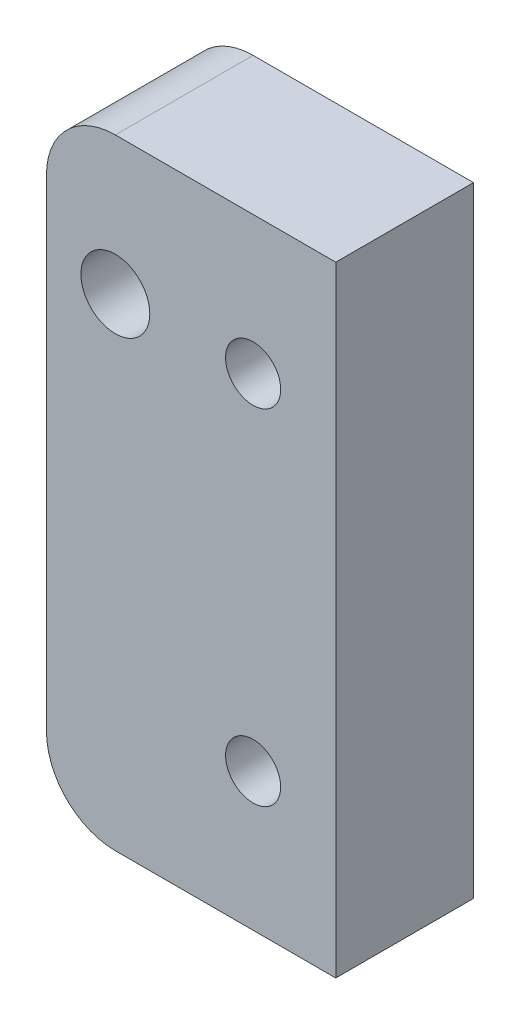
ISO-10303-21;
HEADER;
FILE_DESCRIPTION(('STEP AP214'),'2;1');
FILE_NAME('part.step','',(''),(''),'','','');
FILE_SCHEMA(('AUTOMOTIVE_DESIGN { 1 0 10303 214 1 1 1 1 }'));
ENDSEC;
DATA;
#1=APPLICATION_CONTEXT('core data for automotive mechanical design processes');
#2=APPLICATION_PROTOCOL_DEFINITION('international standard','automotive_design',2000,#1);
#3=PRODUCT_CONTEXT('',#1,'mechanical');
#4=PRODUCT('Part','Part','',(#3));
#5=PRODUCT_RELATED_PRODUCT_CATEGORY('part','',(#4));
#6=PRODUCT_DEFINITION_FORMATION('','',#4);
#7=PRODUCT_DEFINITION_CONTEXT('part definition',#1,'design');
#8=PRODUCT_DEFINITION('design','',#6,#7);
#9=PRODUCT_DEFINITION_SHAPE('','',#8);
#10=(LENGTH_UNIT() NAMED_UNIT(*) SI_UNIT(.MILLI.,.METRE.));
#11=(NAMED_UNIT(*) PLANE_ANGLE_UNIT() SI_UNIT($,.RADIAN.));
#12=(NAMED_UNIT(*) SI_UNIT($,.STERADIAN.) SOLID_ANGLE_UNIT());
#13=UNCERTAINTY_MEASURE_WITH_UNIT(LENGTH_MEASURE(1.E-05),#10,'distance_accuracy_value','');
#14=(GEOMETRIC_REPRESENTATION_CONTEXT(3) GLOBAL_UNCERTAINTY_ASSIGNED_CONTEXT((#13)) GLOBAL_UNIT_ASSIGNED_CONTEXT((#10,
#11,#12)) REPRESENTATION_CONTEXT('',''));
#15=CARTESIAN_POINT('',(0.,0.,0.));
#16=DIRECTION('',(0.,0.,1.));
#17=DIRECTION('',(1.,0.,0.));
#18=AXIS2_PLACEMENT_3D('',#15,#16,#17);
#19=CARTESIAN_POINT('',(-13.1067945180219,-17.1503131524008,0.));
#20=DIRECTION('',(0.,0.,1.));
#21=DIRECTION('',(1.,0.,0.));
#22=AXIS2_PLACEMENT_3D('',#19,#20,#21);
#23=CYLINDRICAL_SURFACE('',#22,2.);
#24=CARTESIAN_POINT('',(-13.1067945180219,-17.1503131524008,10.));
#25=DIRECTION('',(0.,0.,1.));
#26=DIRECTION('',(1.,0.,0.));
#27=AXIS2_PLACEMENT_3D('',#24,#25,#26);
#28=CIRCLE('',#27,2.);
#29=CARTESIAN_POINT('',(-11.1067945180219,-17.1503131524008,10.));
#30=VERTEX_POINT('',#29);
#31=EDGE_CURVE('E264',#30,#30,#28,.T.);
#32=ORIENTED_EDGE('',*,*,#31,.T.);
#33=EDGE_LOOP('',(#32));
#34=FACE_BOUND('',#33,.T.);
#35=CARTESIAN_POINT('',(-13.1067945180219,-17.1503131524008,4.));
#36=DIRECTION('',(0.,0.,-1.));
#37=DIRECTION('',(-1.,0.,0.));
#38=AXIS2_PLACEMENT_3D('',#35,#36,#37);
#39=CIRCLE('',#38,2.);
#40=CARTESIAN_POINT('',(-15.1067945180219,-17.1503131524008,4.));
#41=VERTEX_POINT('',#40);
#42=EDGE_CURVE('E39',#41,#41,#39,.F.);
#43=ORIENTED_EDGE('',*,*,#42,.F.);
#44=EDGE_LOOP('',(#43));
#45=FACE_BOUND('',#44,.T.);
#46=ADVANCED_FACE('F35',(#34,#45),#23,.F.);
#47=CARTESIAN_POINT('',(-13.1067945180219,7.84968684759917,0.));
#48=DIRECTION('',(0.,0.,1.));
#49=DIRECTION('',(1.,0.,0.));
#50=AXIS2_PLACEMENT_3D('',#47,#48,#49);
#51=CYLINDRICAL_SURFACE('',#50,2.);
#52=CARTESIAN_POINT('',(-13.1067945180219,7.84968684759917,10.));
#53=DIRECTION('',(0.,0.,1.));
#54=DIRECTION('',(1.,0.,0.));
#55=AXIS2_PLACEMENT_3D('',#52,#53,#54);
#56=CIRCLE('',#55,2.);
#57=CARTESIAN_POINT('',(-11.1067945180219,7.84968684759917,10.));
#58=VERTEX_POINT('',#57);
#59=EDGE_CURVE('E267',#58,#58,#56,.T.);
#60=ORIENTED_EDGE('',*,*,#59,.T.);
#61=EDGE_LOOP('',(#60));
#62=FACE_BOUND('',#61,.T.);
#63=CARTESIAN_POINT('',(-13.1067945180219,7.84968684759917,4.));
#64=DIRECTION('',(0.,0.,-1.));
#65=DIRECTION('',(-1.,0.,0.));
#66=AXIS2_PLACEMENT_3D('',#63,#64,#65);
#67=CIRCLE('',#66,2.);
#68=CARTESIAN_POINT('',(-15.1067945180219,7.84968684759917,4.));
#69=VERTEX_POINT('',#68);
#70=EDGE_CURVE('E254',#69,#69,#67,.F.);
#71=ORIENTED_EDGE('',*,*,#70,.F.);
#72=EDGE_LOOP('',(#71));
#73=FACE_BOUND('',#72,.T.);
#74=ADVANCED_FACE('F320',(#62,#73),#51,.F.);
#75=CARTESIAN_POINT('',(-28.1067945180219,17.8496868475992,10.));
#76=DIRECTION('',(1.,0.,0.));
#77=DIRECTION('',(0.,1.,0.));
#78=AXIS2_PLACEMENT_3D('',#75,#76,#77);
#79=PLANE('',#78);
#80=DIRECTION('',(0.,-1.,0.));
#81=VECTOR('',#80,1.);
#82=CARTESIAN_POINT('',(-28.1067945180219,17.8496868475992,10.));
#83=LINE('',#82,#81);
#84=CARTESIAN_POINT('',(-28.1067945180219,12.8496868475992,10.));
#85=VERTEX_POINT('',#84);
#86=CARTESIAN_POINT('',(-28.1067945180219,-22.1503131524008,10.));
#87=VERTEX_POINT('',#86);
#88=EDGE_CURVE('E277',#85,#87,#83,.T.);
#89=ORIENTED_EDGE('',*,*,#88,.F.);
#90=DIRECTION('',(0.,0.,-1.));
#91=VECTOR('',#90,1.);
#92=CARTESIAN_POINT('',(-28.1067945180219,12.8496868475992,10.));
#93=LINE('',#92,#91);
#94=CARTESIAN_POINT('',(-28.1067945180219,12.8496868475992,0.));
#95=VERTEX_POINT('',#94);
#96=EDGE_CURVE('E304',#85,#95,#93,.T.);
#97=ORIENTED_EDGE('',*,*,#96,.T.);
#98=DIRECTION('',(0.,-1.,0.));
#99=VECTOR('',#98,1.);
#100=CARTESIAN_POINT('',(-28.1067945180219,17.8496868475992,0.));
#101=LINE('',#100,#99);
#102=CARTESIAN_POINT('',(-28.1067945180219,-22.1503131524008,0.));
#103=VERTEX_POINT('',#102);
#104=EDGE_CURVE('E274',#95,#103,#101,.T.);
#105=ORIENTED_EDGE('',*,*,#104,.T.);
#106=DIRECTION('',(0.,0.,-1.));
#107=VECTOR('',#106,1.);
#108=CARTESIAN_POINT('',(-28.1067945180219,-22.1503131524008,10.));
#109=LINE('',#108,#107);
#110=EDGE_CURVE('E302',#103,#87,#109,.F.);
#111=ORIENTED_EDGE('',*,*,#110,.T.);
#112=EDGE_LOOP('',(#89,#97,#105,#111));
#113=FACE_BOUND('',#112,.T.);
#114=ADVANCED_FACE('F322',(#113),#79,.F.);
#115=CARTESIAN_POINT('',(-28.1067945180219,-27.1503131524008,10.));
#116=DIRECTION('',(0.,1.,0.));
#117=DIRECTION('',(0.,0.,1.));
#118=AXIS2_PLACEMENT_3D('',#115,#116,#117);
#119=PLANE('',#118);
#120=DIRECTION('',(1.,0.,0.));
#121=VECTOR('',#120,1.);
#122=CARTESIAN_POINT('',(-28.1067945180219,-27.1503131524008,10.));
#123=LINE('',#122,#121);
#124=CARTESIAN_POINT('',(-23.1067945180219,-27.1503131524008,10.));
#125=VERTEX_POINT('',#124);
#126=CARTESIAN_POINT('',(-7.10679451802191,-27.1503131524008,10.));
#127=VERTEX_POINT('',#126);
#128=EDGE_CURVE('E280',#125,#127,#123,.T.);
#129=ORIENTED_EDGE('',*,*,#128,.F.);
#130=DIRECTION('',(0.,0.,-1.));
#131=VECTOR('',#130,1.);
#132=CARTESIAN_POINT('',(-23.1067945180219,-27.1503131524008,10.));
#133=LINE('',#132,#131);
#134=CARTESIAN_POINT('',(-23.1067945180219,-27.1503131524008,0.));
#135=VERTEX_POINT('',#134);
#136=EDGE_CURVE('E11',#125,#135,#133,.T.);
#137=ORIENTED_EDGE('',*,*,#136,.T.);
#138=DIRECTION('',(1.,0.,0.));
#139=VECTOR('',#138,1.);
#140=CARTESIAN_POINT('',(-28.1067945180219,-27.1503131524008,0.));
#141=LINE('',#140,#139);
#142=CARTESIAN_POINT('',(-7.10679451802191,-27.1503131524008,0.));
#143=VERTEX_POINT('',#142);
#144=EDGE_CURVE('E291',#135,#143,#141,.T.);
#145=ORIENTED_EDGE('',*,*,#144,.T.);
#146=DIRECTION('',(0.,0.,-1.));
#147=VECTOR('',#146,1.);
#148=CARTESIAN_POINT('',(-7.10679451802191,-27.1503131524008,10.));
#149=LINE('',#148,#147);
#150=EDGE_CURVE('E299',#127,#143,#149,.T.);
#151=ORIENTED_EDGE('',*,*,#150,.F.);
#152=EDGE_LOOP('',(#129,#137,#145,#151));
#153=FACE_BOUND('',#152,.T.);
#154=ADVANCED_FACE('F329',(#153),#119,.F.);
#155=CARTESIAN_POINT('',(-7.10679451802192,17.8496868475992,10.));
#156=DIRECTION('',(-1.,0.,0.));
#157=DIRECTION('',(0.,-1.,0.));
#158=AXIS2_PLACEMENT_3D('',#155,#156,#157);
#159=PLANE('',#158);
#160=DIRECTION('',(0.,1.,0.));
#161=VECTOR('',#160,1.);
#162=CARTESIAN_POINT('',(-7.10679451802192,17.8496868475992,0.));
#163=LINE('',#162,#161);
#164=CARTESIAN_POINT('',(-7.10679451802192,17.8496868475992,0.));
#165=VERTEX_POINT('',#164);
#166=EDGE_CURVE('E293',#143,#165,#163,.T.);
#167=ORIENTED_EDGE('',*,*,#166,.T.);
#168=DIRECTION('',(0.,0.,-1.));
#169=VECTOR('',#168,1.);
#170=CARTESIAN_POINT('',(-7.10679451802192,17.8496868475992,10.));
#171=LINE('',#170,#169);
#172=CARTESIAN_POINT('',(-7.10679451802192,17.8496868475992,10.));
#173=VERTEX_POINT('',#172);
#174=EDGE_CURVE('E288',#173,#165,#171,.T.);
#175=ORIENTED_EDGE('',*,*,#174,.F.);
#176=DIRECTION('',(0.,1.,0.));
#177=VECTOR('',#176,1.);
#178=CARTESIAN_POINT('',(-7.10679451802192,17.8496868475992,10.));
#179=LINE('',#178,#177);
#180=EDGE_CURVE('E283',#127,#173,#179,.T.);
#181=ORIENTED_EDGE('',*,*,#180,.F.);
#182=ORIENTED_EDGE('',*,*,#150,.T.);
#183=EDGE_LOOP('',(#167,#175,#181,#182));
#184=FACE_BOUND('',#183,.T.);
#185=ADVANCED_FACE('F352',(#184),#159,.F.);
#186=CARTESIAN_POINT('',(-28.1067945180219,17.8496868475992,10.));
#187=DIRECTION('',(0.,-1.,0.));
#188=DIRECTION('',(0.,0.,-1.));
#189=AXIS2_PLACEMENT_3D('',#186,#187,#188);
#190=PLANE('',#189);
#191=DIRECTION('',(-1.,0.,0.));
#192=VECTOR('',#191,1.);
#193=CARTESIAN_POINT('',(-28.1067945180219,17.8496868475992,0.));
#194=LINE('',#193,#192);
#195=CARTESIAN_POINT('',(-23.1067945180219,17.8496868475992,0.));
#196=VERTEX_POINT('',#195);
#197=EDGE_CURVE('E281',#165,#196,#194,.T.);
#198=ORIENTED_EDGE('',*,*,#197,.T.);
#199=DIRECTION('',(0.,0.,-1.));
#200=VECTOR('',#199,1.);
#201=CARTESIAN_POINT('',(-23.1067945180219,17.8496868475992,10.));
#202=LINE('',#201,#200);
#203=CARTESIAN_POINT('',(-23.1067945180219,17.8496868475992,10.));
#204=VERTEX_POINT('',#203);
#205=EDGE_CURVE('E311',#196,#204,#202,.F.);
#206=ORIENTED_EDGE('',*,*,#205,.T.);
#207=DIRECTION('',(-1.,0.,0.));
#208=VECTOR('',#207,1.);
#209=CARTESIAN_POINT('',(-28.1067945180219,17.8496868475992,10.));
#210=LINE('',#209,#208);
#211=EDGE_CURVE('E285',#173,#204,#210,.T.);
#212=ORIENTED_EDGE('',*,*,#211,.F.);
#213=ORIENTED_EDGE('',*,*,#174,.T.);
#214=EDGE_LOOP('',(#198,#206,#212,#213));
#215=FACE_BOUND('',#214,.T.);
#216=ADVANCED_FACE('F345',(#215),#190,.F.);
#217=CARTESIAN_POINT('',(0.,0.,10.));
#218=DIRECTION('',(0.,0.,1.));
#219=DIRECTION('',(1.,0.,0.));
#220=AXIS2_PLACEMENT_3D('',#217,#218,#219);
#221=PLANE('',#220);
#222=ORIENTED_EDGE('',*,*,#31,.F.);
#223=EDGE_LOOP('',(#222));
#224=FACE_BOUND('',#223,.T.);
#225=ORIENTED_EDGE('',*,*,#59,.F.);
#226=EDGE_LOOP('',(#225));
#227=FACE_BOUND('',#226,.T.);
#228=CARTESIAN_POINT('',(-23.1067945180219,7.84968684759917,10.));
#229=DIRECTION('',(0.,0.,1.));
#230=DIRECTION('',(1.,0.,0.));
#231=AXIS2_PLACEMENT_3D('',#228,#229,#230);
#232=CIRCLE('',#231,2.5);
#233=CARTESIAN_POINT('',(-20.6067945180219,7.84968684759917,10.));
#234=VERTEX_POINT('',#233);
#235=EDGE_CURVE('E270',#234,#234,#232,.T.);
#236=ORIENTED_EDGE('',*,*,#235,.F.);
#237=EDGE_LOOP('',(#236));
#238=FACE_BOUND('',#237,.T.);
#239=ORIENTED_EDGE('',*,*,#211,.T.);
#240=CARTESIAN_POINT('',(-23.1067945180219,12.8496868475992,10.));
#241=DIRECTION('',(0.,0.,1.));
#242=DIRECTION('',(1.,0.,0.));
#243=AXIS2_PLACEMENT_3D('',#240,#241,#242);
#244=CIRCLE('',#243,5.);
#245=EDGE_CURVE('E44',#204,#85,#244,.T.);
#246=ORIENTED_EDGE('',*,*,#245,.T.);
#247=ORIENTED_EDGE('',*,*,#88,.T.);
#248=CARTESIAN_POINT('',(-23.1067945180219,-22.1503131524008,10.));
#249=DIRECTION('',(0.,0.,1.));
#250=DIRECTION('',(1.,0.,0.));
#251=AXIS2_PLACEMENT_3D('',#248,#249,#250);
#252=CIRCLE('',#251,5.);
#253=EDGE_CURVE('E313',#87,#125,#252,.T.);
#254=ORIENTED_EDGE('',*,*,#253,.T.);
#255=ORIENTED_EDGE('',*,*,#128,.T.);
#256=ORIENTED_EDGE('',*,*,#180,.T.);
#257=EDGE_LOOP('',(#239,#246,#247,#254,#255,#256));
#258=FACE_BOUND('',#257,.T.);
#259=ADVANCED_FACE('F342',(#224,#227,#238,#258),#221,.T.);
#260=CARTESIAN_POINT('',(0.,0.,0.));
#261=DIRECTION('',(0.,0.,1.));
#262=DIRECTION('',(1.,0.,0.));
#263=AXIS2_PLACEMENT_3D('',#260,#261,#262);
#264=PLANE('',#263);
#265=DIRECTION('',(0.866025403784439,0.5,0.));
#266=VECTOR('',#265,1.);
#267=CARTESIAN_POINT('',(-15.8567945180219,-15.5625999121294,0.));
#268=LINE('',#267,#266);
#269=CARTESIAN_POINT('',(-15.8567945180219,-15.5625999121294,0.));
#270=VERTEX_POINT('',#269);
#271=CARTESIAN_POINT('',(-13.1067945180219,-13.9748866718579,0.));
#272=VERTEX_POINT('',#271);
#273=EDGE_CURVE('E198',#270,#272,#268,.T.);
#274=ORIENTED_EDGE('',*,*,#273,.F.);
#275=DIRECTION('',(0.,1.,0.));
#276=VECTOR('',#275,1.);
#277=CARTESIAN_POINT('',(-15.8567945180219,-18.7380263926723,0.));
#278=LINE('',#277,#276);
#279=CARTESIAN_POINT('',(-15.8567945180219,-18.7380263926723,0.));
#280=VERTEX_POINT('',#279);
#281=EDGE_CURVE('E52',#280,#270,#278,.T.);
#282=ORIENTED_EDGE('',*,*,#281,.F.);
#283=DIRECTION('',(-0.866025403784439,0.5,0.));
#284=VECTOR('',#283,1.);
#285=CARTESIAN_POINT('',(-13.1067945180219,-20.3257396329438,0.));
#286=LINE('',#285,#284);
#287=CARTESIAN_POINT('',(-13.1067945180219,-20.3257396329438,0.));
#288=VERTEX_POINT('',#287);
#289=EDGE_CURVE('E184',#288,#280,#286,.T.);
#290=ORIENTED_EDGE('',*,*,#289,.F.);
#291=DIRECTION('',(-0.866025403784439,-0.5,0.));
#292=VECTOR('',#291,1.);
#293=CARTESIAN_POINT('',(-10.3567945180219,-18.7380263926723,0.));
#294=LINE('',#293,#292);
#295=CARTESIAN_POINT('',(-10.3567945180219,-18.7380263926723,0.));
#296=VERTEX_POINT('',#295);
#297=EDGE_CURVE('E187',#296,#288,#294,.T.);
#298=ORIENTED_EDGE('',*,*,#297,.F.);
#299=DIRECTION('',(0.,-1.,0.));
#300=VECTOR('',#299,1.);
#301=CARTESIAN_POINT('',(-10.3567945180219,-15.5625999121294,0.));
#302=LINE('',#301,#300);
#303=CARTESIAN_POINT('',(-10.3567945180219,-15.5625999121294,0.));
#304=VERTEX_POINT('',#303);
#305=EDGE_CURVE('E203',#304,#296,#302,.T.);
#306=ORIENTED_EDGE('',*,*,#305,.F.);
#307=DIRECTION('',(0.866025403784439,-0.499999999999999,0.));
#308=VECTOR('',#307,1.);
#309=CARTESIAN_POINT('',(-13.1067945180219,-13.9748866718579,0.));
#310=LINE('',#309,#308);
#311=EDGE_CURVE('E200',#272,#304,#310,.T.);
#312=ORIENTED_EDGE('',*,*,#311,.F.);
#313=EDGE_LOOP('',(#274,#282,#290,#298,#306,#312));
#314=FACE_BOUND('',#313,.T.);
#315=DIRECTION('',(0.866025403784439,0.5,0.));
#316=VECTOR('',#315,1.);
#317=CARTESIAN_POINT('',(-15.8567945180219,9.43740008787064,0.));
#318=LINE('',#317,#316);
#319=CARTESIAN_POINT('',(-15.8567945180219,9.43740008787064,0.));
#320=VERTEX_POINT('',#319);
#321=CARTESIAN_POINT('',(-13.1067945180219,11.0251133281421,0.));
#322=VERTEX_POINT('',#321);
#323=EDGE_CURVE('E238',#320,#322,#318,.T.);
#324=ORIENTED_EDGE('',*,*,#323,.F.);
#325=DIRECTION('',(0.,1.,0.));
#326=VECTOR('',#325,1.);
#327=CARTESIAN_POINT('',(-15.8567945180219,6.2619736073277,0.));
#328=LINE('',#327,#326);
#329=CARTESIAN_POINT('',(-15.8567945180219,6.2619736073277,0.));
#330=VERTEX_POINT('',#329);
#331=EDGE_CURVE('E60',#330,#320,#328,.T.);
#332=ORIENTED_EDGE('',*,*,#331,.F.);
#333=DIRECTION('',(-0.866025403784439,0.5,0.));
#334=VECTOR('',#333,1.);
#335=CARTESIAN_POINT('',(-13.1067945180219,4.67426036705623,0.));
#336=LINE('',#335,#334);
#337=CARTESIAN_POINT('',(-13.1067945180219,4.67426036705623,0.));
#338=VERTEX_POINT('',#337);
#339=EDGE_CURVE('E221',#338,#330,#336,.T.);
#340=ORIENTED_EDGE('',*,*,#339,.F.);
#341=DIRECTION('',(-0.866025403784439,-0.5,0.));
#342=VECTOR('',#341,1.);
#343=CARTESIAN_POINT('',(-10.3567945180219,6.2619736073277,0.));
#344=LINE('',#343,#342);
#345=CARTESIAN_POINT('',(-10.3567945180219,6.2619736073277,0.));
#346=VERTEX_POINT('',#345);
#347=EDGE_CURVE('E247',#346,#338,#344,.T.);
#348=ORIENTED_EDGE('',*,*,#347,.F.);
#349=DIRECTION('',(0.,-1.,0.));
#350=VECTOR('',#349,1.);
#351=CARTESIAN_POINT('',(-10.3567945180219,9.43740008787064,0.));
#352=LINE('',#351,#350);
#353=CARTESIAN_POINT('',(-10.3567945180219,9.43740008787064,0.));
#354=VERTEX_POINT('',#353);
#355=EDGE_CURVE('E244',#354,#346,#352,.T.);
#356=ORIENTED_EDGE('',*,*,#355,.F.);
#357=DIRECTION('',(0.866025403784439,-0.5,0.));
#358=VECTOR('',#357,1.);
#359=CARTESIAN_POINT('',(-13.1067945180219,11.0251133281421,0.));
#360=LINE('',#359,#358);
#361=EDGE_CURVE('E241',#322,#354,#360,.T.);
#362=ORIENTED_EDGE('',*,*,#361,.F.);
#363=EDGE_LOOP('',(#324,#332,#340,#348,#356,#362));
#364=FACE_BOUND('',#363,.T.);
#365=CARTESIAN_POINT('',(-23.1067945180219,7.84968684759917,0.));
#366=DIRECTION('',(0.,0.,1.));
#367=DIRECTION('',(1.,0.,0.));
#368=AXIS2_PLACEMENT_3D('',#365,#366,#367);
#369=CIRCLE('',#368,2.5);
#370=CARTESIAN_POINT('',(-20.6067945180219,7.84968684759917,0.));
#371=VERTEX_POINT('',#370);
#372=EDGE_CURVE('E271',#371,#371,#369,.T.);
#373=ORIENTED_EDGE('',*,*,#372,.T.);
#374=EDGE_LOOP('',(#373));
#375=FACE_BOUND('',#374,.T.);
#376=ORIENTED_EDGE('',*,*,#104,.F.);
#377=CARTESIAN_POINT('',(-23.1067945180219,12.8496868475992,0.));
#378=DIRECTION('',(0.,0.,1.));
#379=DIRECTION('',(1.,0.,0.));
#380=AXIS2_PLACEMENT_3D('',#377,#378,#379);
#381=CIRCLE('',#380,5.);
#382=EDGE_CURVE('E309',#95,#196,#381,.F.);
#383=ORIENTED_EDGE('',*,*,#382,.T.);
#384=ORIENTED_EDGE('',*,*,#197,.F.);
#385=ORIENTED_EDGE('',*,*,#166,.F.);
#386=ORIENTED_EDGE('',*,*,#144,.F.);
#387=CARTESIAN_POINT('',(-23.1067945180219,-22.1503131524008,0.));
#388=DIRECTION('',(0.,0.,1.));
#389=DIRECTION('',(1.,0.,0.));
#390=AXIS2_PLACEMENT_3D('',#387,#388,#389);
#391=CIRCLE('',#390,5.);
#392=EDGE_CURVE('E307',#135,#103,#391,.F.);
#393=ORIENTED_EDGE('',*,*,#392,.T.);
#394=EDGE_LOOP('',(#376,#383,#384,#385,#386,#393));
#395=FACE_BOUND('',#394,.T.);
#396=ADVANCED_FACE('F340',(#314,#364,#375,#395),#264,.F.);
#397=CARTESIAN_POINT('',(-23.1067945180219,7.84968684759917,0.));
#398=DIRECTION('',(0.,0.,1.));
#399=DIRECTION('',(1.,0.,0.));
#400=AXIS2_PLACEMENT_3D('',#397,#398,#399);
#401=CYLINDRICAL_SURFACE('',#400,2.5);
#402=ORIENTED_EDGE('',*,*,#372,.F.);
#403=EDGE_LOOP('',(#402));
#404=FACE_BOUND('',#403,.T.);
#405=ORIENTED_EDGE('',*,*,#235,.T.);
#406=EDGE_LOOP('',(#405));
#407=FACE_BOUND('',#406,.T.);
#408=ADVANCED_FACE('F336',(#404,#407),#401,.F.);
#409=CARTESIAN_POINT('',(-23.1067945180219,12.8496868475992,10.));
#410=DIRECTION('',(0.,0.,-1.));
#411=DIRECTION('',(-1.,0.,0.));
#412=AXIS2_PLACEMENT_3D('',#409,#410,#411);
#413=CYLINDRICAL_SURFACE('',#412,5.);
#414=ORIENTED_EDGE('',*,*,#245,.F.);
#415=ORIENTED_EDGE('',*,*,#205,.F.);
#416=ORIENTED_EDGE('',*,*,#382,.F.);
#417=ORIENTED_EDGE('',*,*,#96,.F.);
#418=EDGE_LOOP('',(#414,#415,#416,#417));
#419=FACE_BOUND('',#418,.T.);
#420=ADVANCED_FACE('F339',(#419),#413,.T.);
#421=CARTESIAN_POINT('',(-23.1067945180219,-22.1503131524008,10.));
#422=DIRECTION('',(0.,0.,-1.));
#423=DIRECTION('',(-1.,0.,0.));
#424=AXIS2_PLACEMENT_3D('',#421,#422,#423);
#425=CYLINDRICAL_SURFACE('',#424,5.);
#426=ORIENTED_EDGE('',*,*,#253,.F.);
#427=ORIENTED_EDGE('',*,*,#110,.F.);
#428=ORIENTED_EDGE('',*,*,#392,.F.);
#429=ORIENTED_EDGE('',*,*,#136,.F.);
#430=EDGE_LOOP('',(#426,#427,#428,#429));
#431=FACE_BOUND('',#430,.T.);
#432=ADVANCED_FACE('F37',(#431),#425,.T.);
#433=CARTESIAN_POINT('',(0.,0.,4.));
#434=DIRECTION('',(0.,0.,-1.));
#435=DIRECTION('',(-1.,0.,0.));
#436=AXIS2_PLACEMENT_3D('',#433,#434,#435);
#437=PLANE('',#436);
#438=DIRECTION('',(0.,1.,0.));
#439=VECTOR('',#438,1.);
#440=CARTESIAN_POINT('',(-15.8567945180219,6.2619736073277,4.));
#441=LINE('',#440,#439);
#442=CARTESIAN_POINT('',(-15.8567945180219,6.2619736073277,4.));
#443=VERTEX_POINT('',#442);
#444=CARTESIAN_POINT('',(-15.8567945180219,9.43740008787064,4.));
#445=VERTEX_POINT('',#444);
#446=EDGE_CURVE('E217',#443,#445,#441,.T.);
#447=ORIENTED_EDGE('',*,*,#446,.T.);
#448=DIRECTION('',(0.866025403784439,0.5,0.));
#449=VECTOR('',#448,1.);
#450=CARTESIAN_POINT('',(-15.8567945180219,9.43740008787064,4.));
#451=LINE('',#450,#449);
#452=CARTESIAN_POINT('',(-13.1067945180219,11.0251133281421,4.));
#453=VERTEX_POINT('',#452);
#454=EDGE_CURVE('E220',#445,#453,#451,.T.);
#455=ORIENTED_EDGE('',*,*,#454,.T.);
#456=DIRECTION('',(0.866025403784439,-0.5,0.));
#457=VECTOR('',#456,1.);
#458=CARTESIAN_POINT('',(-13.1067945180219,11.0251133281421,4.));
#459=LINE('',#458,#457);
#460=CARTESIAN_POINT('',(-10.3567945180219,9.43740008787064,4.));
#461=VERTEX_POINT('',#460);
#462=EDGE_CURVE('E224',#453,#461,#459,.T.);
#463=ORIENTED_EDGE('',*,*,#462,.T.);
#464=DIRECTION('',(0.,-1.,0.));
#465=VECTOR('',#464,1.);
#466=CARTESIAN_POINT('',(-10.3567945180219,9.43740008787064,4.));
#467=LINE('',#466,#465);
#468=CARTESIAN_POINT('',(-10.3567945180219,6.2619736073277,4.));
#469=VERTEX_POINT('',#468);
#470=EDGE_CURVE('E227',#461,#469,#467,.T.);
#471=ORIENTED_EDGE('',*,*,#470,.T.);
#472=DIRECTION('',(-0.866025403784439,-0.5,0.));
#473=VECTOR('',#472,1.);
#474=CARTESIAN_POINT('',(-10.3567945180219,6.2619736073277,4.));
#475=LINE('',#474,#473);
#476=CARTESIAN_POINT('',(-13.1067945180219,4.67426036705623,4.));
#477=VERTEX_POINT('',#476);
#478=EDGE_CURVE('E230',#469,#477,#475,.T.);
#479=ORIENTED_EDGE('',*,*,#478,.T.);
#480=DIRECTION('',(-0.866025403784439,0.5,0.));
#481=VECTOR('',#480,1.);
#482=CARTESIAN_POINT('',(-13.1067945180219,4.67426036705623,4.));
#483=LINE('',#482,#481);
#484=EDGE_CURVE('E233',#477,#443,#483,.T.);
#485=ORIENTED_EDGE('',*,*,#484,.T.);
#486=EDGE_LOOP('',(#447,#455,#463,#471,#479,#485));
#487=FACE_BOUND('',#486,.T.);
#488=ORIENTED_EDGE('',*,*,#70,.T.);
#489=EDGE_LOOP('',(#488));
#490=FACE_BOUND('',#489,.T.);
#491=ADVANCED_FACE('F318',(#487,#490),#437,.T.);
#492=CARTESIAN_POINT('',(-15.8567945180219,6.2619736073277,4.));
#493=DIRECTION('',(-1.,0.,0.));
#494=DIRECTION('',(0.,0.,1.));
#495=AXIS2_PLACEMENT_3D('',#492,#493,#494);
#496=PLANE('',#495);
#497=ORIENTED_EDGE('',*,*,#331,.T.);
#498=DIRECTION('',(0.,0.,-1.));
#499=VECTOR('',#498,1.);
#500=CARTESIAN_POINT('',(-15.8567945180219,9.43740008787064,4.));
#501=LINE('',#500,#499);
#502=EDGE_CURVE('E236',#445,#320,#501,.T.);
#503=ORIENTED_EDGE('',*,*,#502,.F.);
#504=ORIENTED_EDGE('',*,*,#446,.F.);
#505=DIRECTION('',(0.,0.,-1.));
#506=VECTOR('',#505,1.);
#507=CARTESIAN_POINT('',(-15.8567945180219,6.2619736073277,4.));
#508=LINE('',#507,#506);
#509=EDGE_CURVE('E252',#443,#330,#508,.T.);
#510=ORIENTED_EDGE('',*,*,#509,.T.);
#511=EDGE_LOOP('',(#497,#503,#504,#510));
#512=FACE_BOUND('',#511,.T.);
#513=ADVANCED_FACE('F386',(#512),#496,.F.);
#514=CARTESIAN_POINT('',(-13.1067945180219,4.67426036705623,4.));
#515=DIRECTION('',(-0.5,-0.866025403784439,0.));
#516=DIRECTION('',(0.866025403784439,-0.5,0.));
#517=AXIS2_PLACEMENT_3D('',#514,#515,#516);
#518=PLANE('',#517);
#519=ORIENTED_EDGE('',*,*,#339,.T.);
#520=ORIENTED_EDGE('',*,*,#509,.F.);
#521=ORIENTED_EDGE('',*,*,#484,.F.);
#522=DIRECTION('',(0.,0.,-1.));
#523=VECTOR('',#522,1.);
#524=CARTESIAN_POINT('',(-13.1067945180219,4.67426036705623,4.));
#525=LINE('',#524,#523);
#526=EDGE_CURVE('E255',#477,#338,#525,.T.);
#527=ORIENTED_EDGE('',*,*,#526,.T.);
#528=EDGE_LOOP('',(#519,#520,#521,#527));
#529=FACE_BOUND('',#528,.T.);
#530=ADVANCED_FACE('F392',(#529),#518,.F.);
#531=CARTESIAN_POINT('',(-10.3567945180219,6.2619736073277,4.));
#532=DIRECTION('',(0.5,-0.866025403784439,0.));
#533=DIRECTION('',(0.866025403784439,0.5,0.));
#534=AXIS2_PLACEMENT_3D('',#531,#532,#533);
#535=PLANE('',#534);
#536=ORIENTED_EDGE('',*,*,#347,.T.);
#537=ORIENTED_EDGE('',*,*,#526,.F.);
#538=ORIENTED_EDGE('',*,*,#478,.F.);
#539=DIRECTION('',(0.,0.,-1.));
#540=VECTOR('',#539,1.);
#541=CARTESIAN_POINT('',(-10.3567945180219,6.2619736073277,4.));
#542=LINE('',#541,#540);
#543=EDGE_CURVE('E257',#469,#346,#542,.T.);
#544=ORIENTED_EDGE('',*,*,#543,.T.);
#545=EDGE_LOOP('',(#536,#537,#538,#544));
#546=FACE_BOUND('',#545,.T.);
#547=ADVANCED_FACE('F398',(#546),#535,.F.);
#548=CARTESIAN_POINT('',(-10.3567945180219,9.43740008787064,4.));
#549=DIRECTION('',(1.,0.,0.));
#550=DIRECTION('',(0.,0.,-1.));
#551=AXIS2_PLACEMENT_3D('',#548,#549,#550);
#552=PLANE('',#551);
#553=ORIENTED_EDGE('',*,*,#355,.T.);
#554=ORIENTED_EDGE('',*,*,#543,.F.);
#555=ORIENTED_EDGE('',*,*,#470,.F.);
#556=DIRECTION('',(0.,0.,-1.));
#557=VECTOR('',#556,1.);
#558=CARTESIAN_POINT('',(-10.3567945180219,9.43740008787064,4.));
#559=LINE('',#558,#557);
#560=EDGE_CURVE('E259',#461,#354,#559,.T.);
#561=ORIENTED_EDGE('',*,*,#560,.T.);
#562=EDGE_LOOP('',(#553,#554,#555,#561));
#563=FACE_BOUND('',#562,.T.);
#564=ADVANCED_FACE('F402',(#563),#552,.F.);
#565=CARTESIAN_POINT('',(-13.1067945180219,11.0251133281421,4.));
#566=DIRECTION('',(0.5,0.866025403784439,0.));
#567=DIRECTION('',(-0.866025403784439,0.5,0.));
#568=AXIS2_PLACEMENT_3D('',#565,#566,#567);
#569=PLANE('',#568);
#570=ORIENTED_EDGE('',*,*,#361,.T.);
#571=ORIENTED_EDGE('',*,*,#560,.F.);
#572=ORIENTED_EDGE('',*,*,#462,.F.);
#573=DIRECTION('',(0.,0.,-1.));
#574=VECTOR('',#573,1.);
#575=CARTESIAN_POINT('',(-13.1067945180219,11.0251133281421,4.));
#576=LINE('',#575,#574);
#577=EDGE_CURVE('E261',#453,#322,#576,.T.);
#578=ORIENTED_EDGE('',*,*,#577,.T.);
#579=EDGE_LOOP('',(#570,#571,#572,#578));
#580=FACE_BOUND('',#579,.T.);
#581=ADVANCED_FACE('F406',(#580),#569,.F.);
#582=CARTESIAN_POINT('',(-15.8567945180219,9.43740008787064,4.));
#583=DIRECTION('',(-0.5,0.866025403784439,0.));
#584=DIRECTION('',(-0.866025403784439,-0.5,0.));
#585=AXIS2_PLACEMENT_3D('',#582,#583,#584);
#586=PLANE('',#585);
#587=ORIENTED_EDGE('',*,*,#323,.T.);
#588=ORIENTED_EDGE('',*,*,#577,.F.);
#589=ORIENTED_EDGE('',*,*,#454,.F.);
#590=ORIENTED_EDGE('',*,*,#502,.T.);
#591=EDGE_LOOP('',(#587,#588,#589,#590));
#592=FACE_BOUND('',#591,.T.);
#593=ADVANCED_FACE('F410',(#592),#586,.F.);
#594=CARTESIAN_POINT('',(0.,0.,4.));
#595=DIRECTION('',(0.,0.,-1.));
#596=DIRECTION('',(-1.,0.,0.));
#597=AXIS2_PLACEMENT_3D('',#594,#595,#596);
#598=PLANE('',#597);
#599=DIRECTION('',(0.,1.,0.));
#600=VECTOR('',#599,1.);
#601=CARTESIAN_POINT('',(-15.8567945180219,-18.7380263926723,4.));
#602=LINE('',#601,#600);
#603=CARTESIAN_POINT('',(-15.8567945180219,-18.7380263926723,4.));
#604=VERTEX_POINT('',#603);
#605=CARTESIAN_POINT('',(-15.8567945180219,-15.5625999121294,4.));
#606=VERTEX_POINT('',#605);
#607=EDGE_CURVE('E164',#604,#606,#602,.T.);
#608=ORIENTED_EDGE('',*,*,#607,.T.);
#609=DIRECTION('',(0.866025403784439,0.5,0.));
#610=VECTOR('',#609,1.);
#611=CARTESIAN_POINT('',(-15.8567945180219,-15.5625999121294,4.));
#612=LINE('',#611,#610);
#613=CARTESIAN_POINT('',(-13.1067945180219,-13.9748866718579,4.));
#614=VERTEX_POINT('',#613);
#615=EDGE_CURVE('E173',#606,#614,#612,.T.);
#616=ORIENTED_EDGE('',*,*,#615,.T.);
#617=DIRECTION('',(0.866025403784439,-0.499999999999999,0.));
#618=VECTOR('',#617,1.);
#619=CARTESIAN_POINT('',(-13.1067945180219,-13.9748866718579,4.));
#620=LINE('',#619,#618);
#621=CARTESIAN_POINT('',(-10.3567945180219,-15.5625999121294,4.));
#622=VERTEX_POINT('',#621);
#623=EDGE_CURVE('E178',#614,#622,#620,.T.);
#624=ORIENTED_EDGE('',*,*,#623,.T.);
#625=DIRECTION('',(0.,-1.,0.));
#626=VECTOR('',#625,1.);
#627=CARTESIAN_POINT('',(-10.3567945180219,-15.5625999121294,4.));
#628=LINE('',#627,#626);
#629=CARTESIAN_POINT('',(-10.3567945180219,-18.7380263926723,4.));
#630=VERTEX_POINT('',#629);
#631=EDGE_CURVE('E191',#622,#630,#628,.T.);
#632=ORIENTED_EDGE('',*,*,#631,.T.);
#633=DIRECTION('',(-0.866025403784439,-0.5,0.));
#634=VECTOR('',#633,1.);
#635=CARTESIAN_POINT('',(-10.3567945180219,-18.7380263926723,4.));
#636=LINE('',#635,#634);
#637=CARTESIAN_POINT('',(-13.1067945180219,-20.3257396329438,4.));
#638=VERTEX_POINT('',#637);
#639=EDGE_CURVE('E194',#630,#638,#636,.T.);
#640=ORIENTED_EDGE('',*,*,#639,.T.);
#641=DIRECTION('',(-0.866025403784439,0.5,0.));
#642=VECTOR('',#641,1.);
#643=CARTESIAN_POINT('',(-13.1067945180219,-20.3257396329438,4.));
#644=LINE('',#643,#642);
#645=EDGE_CURVE('E170',#638,#604,#644,.T.);
#646=ORIENTED_EDGE('',*,*,#645,.T.);
#647=EDGE_LOOP('',(#608,#616,#624,#632,#640,#646));
#648=FACE_BOUND('',#647,.T.);
#649=ORIENTED_EDGE('',*,*,#42,.T.);
#650=EDGE_LOOP('',(#649));
#651=FACE_BOUND('',#650,.T.);
#652=ADVANCED_FACE('F180',(#648,#651),#598,.T.);
#653=CARTESIAN_POINT('',(-15.8567945180219,-18.7380263926723,4.));
#654=DIRECTION('',(-1.,0.,0.));
#655=DIRECTION('',(0.,-1.,0.));
#656=AXIS2_PLACEMENT_3D('',#653,#654,#655);
#657=PLANE('',#656);
#658=ORIENTED_EDGE('',*,*,#281,.T.);
#659=DIRECTION('',(0.,0.,-1.));
#660=VECTOR('',#659,1.);
#661=CARTESIAN_POINT('',(-15.8567945180219,-15.5625999121294,4.));
#662=LINE('',#661,#660);
#663=EDGE_CURVE('E160',#606,#270,#662,.T.);
#664=ORIENTED_EDGE('',*,*,#663,.F.);
#665=ORIENTED_EDGE('',*,*,#607,.F.);
#666=DIRECTION('',(0.,0.,-1.));
#667=VECTOR('',#666,1.);
#668=CARTESIAN_POINT('',(-15.8567945180219,-18.7380263926723,4.));
#669=LINE('',#668,#667);
#670=EDGE_CURVE('E208',#604,#280,#669,.T.);
#671=ORIENTED_EDGE('',*,*,#670,.T.);
#672=EDGE_LOOP('',(#658,#664,#665,#671));
#673=FACE_BOUND('',#672,.T.);
#674=ADVANCED_FACE('F162',(#673),#657,.F.);
#675=CARTESIAN_POINT('',(-13.1067945180219,-20.3257396329438,4.));
#676=DIRECTION('',(-0.5,-0.866025403784439,0.));
#677=DIRECTION('',(0.866025403784439,-0.5,0.));
#678=AXIS2_PLACEMENT_3D('',#675,#676,#677);
#679=PLANE('',#678);
#680=ORIENTED_EDGE('',*,*,#289,.T.);
#681=ORIENTED_EDGE('',*,*,#670,.F.);
#682=ORIENTED_EDGE('',*,*,#645,.F.);
#683=DIRECTION('',(0.,0.,-1.));
#684=VECTOR('',#683,1.);
#685=CARTESIAN_POINT('',(-13.1067945180219,-20.3257396329438,4.));
#686=LINE('',#685,#684);
#687=EDGE_CURVE('E210',#638,#288,#686,.T.);
#688=ORIENTED_EDGE('',*,*,#687,.T.);
#689=EDGE_LOOP('',(#680,#681,#682,#688));
#690=FACE_BOUND('',#689,.T.);
#691=ADVANCED_FACE('F438',(#690),#679,.F.);
#692=CARTESIAN_POINT('',(-10.3567945180219,-18.7380263926723,4.));
#693=DIRECTION('',(0.5,-0.866025403784439,0.));
#694=DIRECTION('',(0.866025403784439,0.5,0.));
#695=AXIS2_PLACEMENT_3D('',#692,#693,#694);
#696=PLANE('',#695);
#697=ORIENTED_EDGE('',*,*,#297,.T.);
#698=ORIENTED_EDGE('',*,*,#687,.F.);
#699=ORIENTED_EDGE('',*,*,#639,.F.);
#700=DIRECTION('',(0.,0.,-1.));
#701=VECTOR('',#700,1.);
#702=CARTESIAN_POINT('',(-10.3567945180219,-18.7380263926723,4.));
#703=LINE('',#702,#701);
#704=EDGE_CURVE('E212',#630,#296,#703,.T.);
#705=ORIENTED_EDGE('',*,*,#704,.T.);
#706=EDGE_LOOP('',(#697,#698,#699,#705));
#707=FACE_BOUND('',#706,.T.);
#708=ADVANCED_FACE('F442',(#707),#696,.F.);
#709=CARTESIAN_POINT('',(-10.3567945180219,-15.5625999121294,4.));
#710=DIRECTION('',(1.,0.,0.));
#711=DIRECTION('',(0.,0.,-1.));
#712=AXIS2_PLACEMENT_3D('',#709,#710,#711);
#713=PLANE('',#712);
#714=ORIENTED_EDGE('',*,*,#305,.T.);
#715=ORIENTED_EDGE('',*,*,#704,.F.);
#716=ORIENTED_EDGE('',*,*,#631,.F.);
#717=DIRECTION('',(0.,0.,-1.));
#718=VECTOR('',#717,1.);
#719=CARTESIAN_POINT('',(-10.3567945180219,-15.5625999121294,4.));
#720=LINE('',#719,#718);
#721=EDGE_CURVE('E214',#622,#304,#720,.T.);
#722=ORIENTED_EDGE('',*,*,#721,.T.);
#723=EDGE_LOOP('',(#714,#715,#716,#722));
#724=FACE_BOUND('',#723,.T.);
#725=ADVANCED_FACE('F446',(#724),#713,.F.);
#726=CARTESIAN_POINT('',(-13.1067945180219,-13.9748866718579,4.));
#727=DIRECTION('',(0.499999999999999,0.866025403784439,0.));
#728=DIRECTION('',(-0.866025403784439,0.499999999999999,0.));
#729=AXIS2_PLACEMENT_3D('',#726,#727,#728);
#730=PLANE('',#729);
#731=ORIENTED_EDGE('',*,*,#311,.T.);
#732=ORIENTED_EDGE('',*,*,#721,.F.);
#733=ORIENTED_EDGE('',*,*,#623,.F.);
#734=DIRECTION('',(0.,0.,-1.));
#735=VECTOR('',#734,1.);
#736=CARTESIAN_POINT('',(-13.1067945180219,-13.9748866718579,4.));
#737=LINE('',#736,#735);
#738=EDGE_CURVE('E169',#614,#272,#737,.T.);
#739=ORIENTED_EDGE('',*,*,#738,.T.);
#740=EDGE_LOOP('',(#731,#732,#733,#739));
#741=FACE_BOUND('',#740,.T.);
#742=ADVANCED_FACE('F450',(#741),#730,.F.);
#743=CARTESIAN_POINT('',(-15.8567945180219,-15.5625999121294,4.));
#744=DIRECTION('',(-0.5,0.866025403784439,0.));
#745=DIRECTION('',(-0.866025403784439,-0.5,0.));
#746=AXIS2_PLACEMENT_3D('',#743,#744,#745);
#747=PLANE('',#746);
#748=ORIENTED_EDGE('',*,*,#273,.T.);
#749=ORIENTED_EDGE('',*,*,#738,.F.);
#750=ORIENTED_EDGE('',*,*,#615,.F.);
#751=ORIENTED_EDGE('',*,*,#663,.T.);
#752=EDGE_LOOP('',(#748,#749,#750,#751));
#753=FACE_BOUND('',#752,.T.);
#754=ADVANCED_FACE('F174',(#753),#747,.F.);
#755=CLOSED_SHELL('',(#46,#74,#114,#154,#185,#216,#259,#396,#408,#420,#432,#491,#513,#530,#547,
#564,#581,#593,#652,#674,#691,#708,#725,#742,#754));
#756=MANIFOLD_SOLID_BREP('B2',#755);
#757=ADVANCED_BREP_SHAPE_REPRESENTATION('',(#18,#756),#14);
#758=SHAPE_DEFINITION_REPRESENTATION(#9,#757);
ENDSEC;
END-ISO-10303-21;
